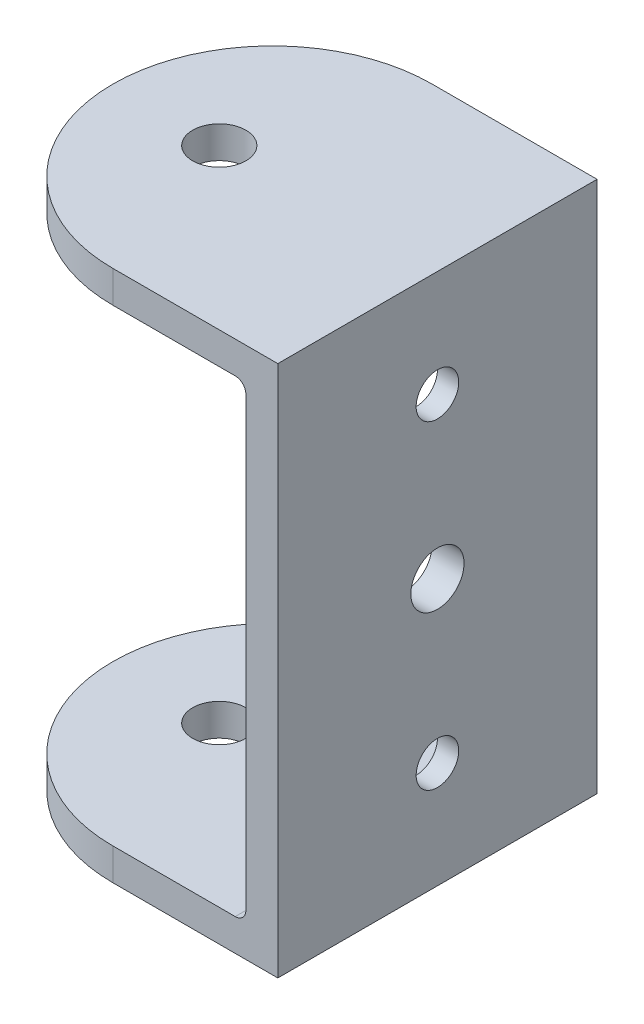
ISO-10303-21;
HEADER;
FILE_DESCRIPTION(('STEP AP214'),'2;1');
FILE_NAME('part.step','',(''),(''),'','','');
FILE_SCHEMA(('AUTOMOTIVE_DESIGN { 1 0 10303 214 1 1 1 1 }'));
ENDSEC;
DATA;
#1=APPLICATION_CONTEXT('core data for automotive mechanical design processes');
#2=APPLICATION_PROTOCOL_DEFINITION('international standard','automotive_design',2000,#1);
#3=PRODUCT_CONTEXT('',#1,'mechanical');
#4=PRODUCT('Part','Part','',(#3));
#5=PRODUCT_RELATED_PRODUCT_CATEGORY('part','',(#4));
#6=PRODUCT_DEFINITION_FORMATION('','',#4);
#7=PRODUCT_DEFINITION_CONTEXT('part definition',#1,'design');
#8=PRODUCT_DEFINITION('design','',#6,#7);
#9=PRODUCT_DEFINITION_SHAPE('','',#8);
#10=(LENGTH_UNIT() NAMED_UNIT(*) SI_UNIT(.MILLI.,.METRE.));
#11=(NAMED_UNIT(*) PLANE_ANGLE_UNIT() SI_UNIT($,.RADIAN.));
#12=(NAMED_UNIT(*) SI_UNIT($,.STERADIAN.) SOLID_ANGLE_UNIT());
#13=UNCERTAINTY_MEASURE_WITH_UNIT(LENGTH_MEASURE(1.E-05),#10,'distance_accuracy_value','');
#14=(GEOMETRIC_REPRESENTATION_CONTEXT(3) GLOBAL_UNCERTAINTY_ASSIGNED_CONTEXT((#13)) GLOBAL_UNIT_ASSIGNED_CONTEXT((#10,
#11,#12)) REPRESENTATION_CONTEXT('',''));
#15=CARTESIAN_POINT('',(0.,0.,0.));
#16=DIRECTION('',(0.,0.,1.));
#17=DIRECTION('',(1.,0.,0.));
#18=AXIS2_PLACEMENT_3D('',#15,#16,#17);
#19=CARTESIAN_POINT('',(0.,-30.,0.));
#20=DIRECTION('',(-1.,0.,0.));
#21=DIRECTION('',(0.,-1.,0.));
#22=AXIS2_PLACEMENT_3D('',#19,#20,#21);
#23=CYLINDRICAL_SURFACE('',#22,4.);
#24=CARTESIAN_POINT('',(0.,-30.,0.));
#25=DIRECTION('',(-1.,0.,0.));
#26=DIRECTION('',(0.,-1.,0.));
#27=AXIS2_PLACEMENT_3D('',#24,#25,#26);
#28=CIRCLE('',#27,4.);
#29=CARTESIAN_POINT('',(0.,-34.,0.));
#30=VERTEX_POINT('',#29);
#31=EDGE_CURVE('E223',#30,#30,#28,.T.);
#32=ORIENTED_EDGE('',*,*,#31,.F.);
#33=EDGE_LOOP('',(#32));
#34=FACE_BOUND('',#33,.T.);
#35=CARTESIAN_POINT('',(-3.99999999999999,-30.,0.));
#36=DIRECTION('',(-1.,0.,0.));
#37=DIRECTION('',(0.,-1.,0.));
#38=AXIS2_PLACEMENT_3D('',#35,#36,#37);
#39=CIRCLE('',#38,4.);
#40=CARTESIAN_POINT('',(-3.99999999999999,-34.,0.));
#41=VERTEX_POINT('',#40);
#42=EDGE_CURVE('E219',#41,#41,#39,.F.);
#43=ORIENTED_EDGE('',*,*,#42,.F.);
#44=EDGE_LOOP('',(#43));
#45=FACE_BOUND('',#44,.T.);
#46=ADVANCED_FACE('F41',(#34,#45),#23,.F.);
#47=CARTESIAN_POINT('',(0.,30.,0.));
#48=DIRECTION('',(-1.,0.,0.));
#49=DIRECTION('',(0.,-1.,0.));
#50=AXIS2_PLACEMENT_3D('',#47,#48,#49);
#51=CYLINDRICAL_SURFACE('',#50,4.);
#52=CARTESIAN_POINT('',(0.,30.,0.));
#53=DIRECTION('',(-1.,0.,0.));
#54=DIRECTION('',(0.,-1.,0.));
#55=AXIS2_PLACEMENT_3D('',#52,#53,#54);
#56=CIRCLE('',#55,4.);
#57=CARTESIAN_POINT('',(0.,26.,0.));
#58=VERTEX_POINT('',#57);
#59=EDGE_CURVE('E215',#58,#58,#56,.T.);
#60=ORIENTED_EDGE('',*,*,#59,.F.);
#61=EDGE_LOOP('',(#60));
#62=FACE_BOUND('',#61,.T.);
#63=CARTESIAN_POINT('',(-4.,30.,0.));
#64=DIRECTION('',(-1.,0.,0.));
#65=DIRECTION('',(0.,-1.,0.));
#66=AXIS2_PLACEMENT_3D('',#63,#64,#65);
#67=CIRCLE('',#66,4.);
#68=CARTESIAN_POINT('',(-4.,26.,0.));
#69=VERTEX_POINT('',#68);
#70=EDGE_CURVE('E216',#69,#69,#67,.F.);
#71=ORIENTED_EDGE('',*,*,#70,.F.);
#72=EDGE_LOOP('',(#71));
#73=FACE_BOUND('',#72,.T.);
#74=ADVANCED_FACE('F280',(#62,#73),#51,.F.);
#75=CARTESIAN_POINT('',(0.,-44.,-30.));
#76=DIRECTION('',(0.,1.,0.));
#77=DIRECTION('',(0.,0.,1.));
#78=AXIS2_PLACEMENT_3D('',#75,#76,#77);
#79=PLANE('',#78);
#80=CARTESIAN_POINT('',(-41.,-44.,0.));
#81=DIRECTION('',(0.,1.,0.));
#82=DIRECTION('',(0.,0.,1.));
#83=AXIS2_PLACEMENT_3D('',#80,#81,#82);
#84=CIRCLE('',#83,5.);
#85=CARTESIAN_POINT('',(-41.,-44.,5.));
#86=VERTEX_POINT('',#85);
#87=EDGE_CURVE('E169',#86,#86,#84,.T.);
#88=ORIENTED_EDGE('',*,*,#87,.F.);
#89=EDGE_LOOP('',(#88));
#90=FACE_BOUND('',#89,.T.);
#91=DIRECTION('',(-1.,0.,0.));
#92=VECTOR('',#91,1.);
#93=CARTESIAN_POINT('',(0.,-44.,30.));
#94=LINE('',#93,#92);
#95=CARTESIAN_POINT('',(-7.99999999999999,-44.,30.));
#96=VERTEX_POINT('',#95);
#97=CARTESIAN_POINT('',(-31.,-44.,30.));
#98=VERTEX_POINT('',#97);
#99=EDGE_CURVE('E166',#96,#98,#94,.T.);
#100=ORIENTED_EDGE('',*,*,#99,.F.);
#101=DIRECTION('',(0.,0.,1.));
#102=VECTOR('',#101,1.);
#103=CARTESIAN_POINT('',(-7.99999999999999,-44.,-30.));
#104=LINE('',#103,#102);
#105=CARTESIAN_POINT('',(-7.99999999999999,-44.,-30.));
#106=VERTEX_POINT('',#105);
#107=EDGE_CURVE('E228',#96,#106,#104,.F.);
#108=ORIENTED_EDGE('',*,*,#107,.T.);
#109=DIRECTION('',(-1.,0.,0.));
#110=VECTOR('',#109,1.);
#111=CARTESIAN_POINT('',(0.,-44.,-30.));
#112=LINE('',#111,#110);
#113=CARTESIAN_POINT('',(-31.,-44.,-30.));
#114=VERTEX_POINT('',#113);
#115=EDGE_CURVE('E155',#106,#114,#112,.T.);
#116=ORIENTED_EDGE('',*,*,#115,.T.);
#117=CARTESIAN_POINT('',(-31.,-44.,0.));
#118=DIRECTION('',(0.,1.,0.));
#119=DIRECTION('',(0.,0.,1.));
#120=AXIS2_PLACEMENT_3D('',#117,#118,#119);
#121=CIRCLE('',#120,30.);
#122=CARTESIAN_POINT('',(-61.,-44.,0.));
#123=VERTEX_POINT('',#122);
#124=EDGE_CURVE('E189',#114,#123,#121,.T.);
#125=ORIENTED_EDGE('',*,*,#124,.T.);
#126=CARTESIAN_POINT('',(-31.,-44.,0.));
#127=DIRECTION('',(0.,1.,0.));
#128=DIRECTION('',(0.,0.,1.));
#129=AXIS2_PLACEMENT_3D('',#126,#127,#128);
#130=CIRCLE('',#129,30.);
#131=EDGE_CURVE('E191',#123,#98,#130,.T.);
#132=ORIENTED_EDGE('',*,*,#131,.T.);
#133=EDGE_LOOP('',(#100,#108,#116,#125,#132));
#134=FACE_BOUND('',#133,.T.);
#135=ADVANCED_FACE('F262',(#90,#134),#79,.T.);
#136=CARTESIAN_POINT('',(-5.99999999999999,0.,-30.));
#137=DIRECTION('',(-1.,0.,0.));
#138=DIRECTION('',(0.,-1.,0.));
#139=AXIS2_PLACEMENT_3D('',#136,#137,#138);
#140=PLANE('',#139);
#141=CARTESIAN_POINT('',(-6.,30.,0.));
#142=DIRECTION('',(-1.,0.,0.));
#143=DIRECTION('',(0.,-1.,0.));
#144=AXIS2_PLACEMENT_3D('',#141,#142,#143);
#145=CIRCLE('',#144,7.);
#146=CARTESIAN_POINT('',(-6.,23.,0.));
#147=VERTEX_POINT('',#146);
#148=EDGE_CURVE('E519',#147,#147,#145,.T.);
#149=ORIENTED_EDGE('',*,*,#148,.F.);
#150=EDGE_LOOP('',(#149));
#151=FACE_BOUND('',#150,.T.);
#152=CARTESIAN_POINT('',(-5.99999999999999,-30.,0.));
#153=DIRECTION('',(-1.,0.,0.));
#154=DIRECTION('',(0.,-1.,0.));
#155=AXIS2_PLACEMENT_3D('',#152,#153,#154);
#156=CIRCLE('',#155,7.);
#157=CARTESIAN_POINT('',(-5.99999999999999,-37.,0.));
#158=VERTEX_POINT('',#157);
#159=EDGE_CURVE('E516',#158,#158,#156,.T.);
#160=ORIENTED_EDGE('',*,*,#159,.F.);
#161=EDGE_LOOP('',(#160));
#162=FACE_BOUND('',#161,.T.);
#163=CARTESIAN_POINT('',(-5.99999999999999,0.,0.));
#164=DIRECTION('',(-1.,0.,0.));
#165=DIRECTION('',(0.,-1.,0.));
#166=AXIS2_PLACEMENT_3D('',#163,#164,#165);
#167=CIRCLE('',#166,5.);
#168=CARTESIAN_POINT('',(-5.99999999999999,-5.,0.));
#169=VERTEX_POINT('',#168);
#170=EDGE_CURVE('E508',#169,#169,#167,.T.);
#171=ORIENTED_EDGE('',*,*,#170,.F.);
#172=EDGE_LOOP('',(#171));
#173=FACE_BOUND('',#172,.T.);
#174=DIRECTION('',(0.,-1.,0.));
#175=VECTOR('',#174,1.);
#176=CARTESIAN_POINT('',(-5.99999999999999,0.,-30.));
#177=LINE('',#176,#175);
#178=CARTESIAN_POINT('',(-6.,42.,-30.));
#179=VERTEX_POINT('',#178);
#180=CARTESIAN_POINT('',(-5.99999999999999,-42.,-30.));
#181=VERTEX_POINT('',#180);
#182=EDGE_CURVE('E150',#179,#181,#177,.T.);
#183=ORIENTED_EDGE('',*,*,#182,.T.);
#184=DIRECTION('',(0.,0.,1.));
#185=VECTOR('',#184,1.);
#186=CARTESIAN_POINT('',(-5.99999999999999,-42.,30.));
#187=LINE('',#186,#185);
#188=CARTESIAN_POINT('',(-5.99999999999999,-42.,30.));
#189=VERTEX_POINT('',#188);
#190=EDGE_CURVE('E225',#181,#189,#187,.T.);
#191=ORIENTED_EDGE('',*,*,#190,.T.);
#192=DIRECTION('',(0.,-1.,0.));
#193=VECTOR('',#192,1.);
#194=CARTESIAN_POINT('',(-5.99999999999999,0.,30.));
#195=LINE('',#194,#193);
#196=CARTESIAN_POINT('',(-6.,42.,30.));
#197=VERTEX_POINT('',#196);
#198=EDGE_CURVE('E157',#197,#189,#195,.T.);
#199=ORIENTED_EDGE('',*,*,#198,.F.);
#200=DIRECTION('',(0.,0.,1.));
#201=VECTOR('',#200,1.);
#202=CARTESIAN_POINT('',(-6.,42.,-30.));
#203=LINE('',#202,#201);
#204=EDGE_CURVE('E207',#197,#179,#203,.F.);
#205=ORIENTED_EDGE('',*,*,#204,.T.);
#206=EDGE_LOOP('',(#183,#191,#199,#205));
#207=FACE_BOUND('',#206,.T.);
#208=ADVANCED_FACE('F240',(#151,#162,#173,#207),#140,.T.);
#209=CARTESIAN_POINT('',(0.,44.,-30.));
#210=DIRECTION('',(0.,1.,0.));
#211=DIRECTION('',(0.,0.,1.));
#212=AXIS2_PLACEMENT_3D('',#209,#210,#211);
#213=PLANE('',#212);
#214=CARTESIAN_POINT('',(-41.,44.,0.));
#215=DIRECTION('',(0.,1.,0.));
#216=DIRECTION('',(0.,0.,1.));
#217=AXIS2_PLACEMENT_3D('',#214,#215,#216);
#218=CIRCLE('',#217,5.);
#219=CARTESIAN_POINT('',(-41.,44.,5.));
#220=VERTEX_POINT('',#219);
#221=EDGE_CURVE('E495',#220,#220,#218,.T.);
#222=ORIENTED_EDGE('',*,*,#221,.T.);
#223=EDGE_LOOP('',(#222));
#224=FACE_BOUND('',#223,.T.);
#225=DIRECTION('',(-1.,0.,0.));
#226=VECTOR('',#225,1.);
#227=CARTESIAN_POINT('',(0.,44.,-30.));
#228=LINE('',#227,#226);
#229=CARTESIAN_POINT('',(-8.,44.,-30.));
#230=VERTEX_POINT('',#229);
#231=CARTESIAN_POINT('',(-31.,44.,-30.));
#232=VERTEX_POINT('',#231);
#233=EDGE_CURVE('E162',#230,#232,#228,.T.);
#234=ORIENTED_EDGE('',*,*,#233,.F.);
#235=DIRECTION('',(0.,0.,1.));
#236=VECTOR('',#235,1.);
#237=CARTESIAN_POINT('',(-8.,44.,-30.));
#238=LINE('',#237,#236);
#239=CARTESIAN_POINT('',(-8.,44.,30.));
#240=VERTEX_POINT('',#239);
#241=EDGE_CURVE('E230',#230,#240,#238,.T.);
#242=ORIENTED_EDGE('',*,*,#241,.T.);
#243=DIRECTION('',(-1.,0.,0.));
#244=VECTOR('',#243,1.);
#245=CARTESIAN_POINT('',(0.,44.,30.));
#246=LINE('',#245,#244);
#247=CARTESIAN_POINT('',(-31.,44.,30.));
#248=VERTEX_POINT('',#247);
#249=EDGE_CURVE('E175',#240,#248,#246,.T.);
#250=ORIENTED_EDGE('',*,*,#249,.T.);
#251=CARTESIAN_POINT('',(-31.,44.,0.));
#252=DIRECTION('',(0.,1.,0.));
#253=DIRECTION('',(0.,0.,1.));
#254=AXIS2_PLACEMENT_3D('',#251,#252,#253);
#255=CIRCLE('',#254,30.);
#256=CARTESIAN_POINT('',(-61.,44.,0.));
#257=VERTEX_POINT('',#256);
#258=EDGE_CURVE('E198',#248,#257,#255,.F.);
#259=ORIENTED_EDGE('',*,*,#258,.T.);
#260=CARTESIAN_POINT('',(-31.,44.,0.));
#261=DIRECTION('',(0.,1.,0.));
#262=DIRECTION('',(0.,0.,1.));
#263=AXIS2_PLACEMENT_3D('',#260,#261,#262);
#264=CIRCLE('',#263,30.);
#265=EDGE_CURVE('E200',#257,#232,#264,.F.);
#266=ORIENTED_EDGE('',*,*,#265,.T.);
#267=EDGE_LOOP('',(#234,#242,#250,#259,#266));
#268=FACE_BOUND('',#267,.T.);
#269=ADVANCED_FACE('F243',(#224,#268),#213,.F.);
#270=CARTESIAN_POINT('',(0.,50.,-30.));
#271=DIRECTION('',(0.,1.,0.));
#272=DIRECTION('',(-1.,0.,0.));
#273=AXIS2_PLACEMENT_3D('',#270,#271,#272);
#274=PLANE('',#273);
#275=CARTESIAN_POINT('',(-41.,50.,0.));
#276=DIRECTION('',(0.,1.,0.));
#277=DIRECTION('',(0.,0.,1.));
#278=AXIS2_PLACEMENT_3D('',#275,#276,#277);
#279=CIRCLE('',#278,5.);
#280=CARTESIAN_POINT('',(-41.,50.,5.));
#281=VERTEX_POINT('',#280);
#282=EDGE_CURVE('E211',#281,#281,#279,.T.);
#283=ORIENTED_EDGE('',*,*,#282,.F.);
#284=EDGE_LOOP('',(#283));
#285=FACE_BOUND('',#284,.T.);
#286=DIRECTION('',(-1.,0.,0.));
#287=VECTOR('',#286,1.);
#288=CARTESIAN_POINT('',(0.,50.,-30.));
#289=LINE('',#288,#287);
#290=CARTESIAN_POINT('',(0.,50.,-30.));
#291=VERTEX_POINT('',#290);
#292=CARTESIAN_POINT('',(-31.,50.,-30.));
#293=VERTEX_POINT('',#292);
#294=EDGE_CURVE('E138',#291,#293,#289,.T.);
#295=ORIENTED_EDGE('',*,*,#294,.T.);
#296=CARTESIAN_POINT('',(-31.,50.,0.));
#297=DIRECTION('',(0.,1.,0.));
#298=DIRECTION('',(-1.,0.,0.));
#299=AXIS2_PLACEMENT_3D('',#296,#297,#298);
#300=CIRCLE('',#299,30.);
#301=CARTESIAN_POINT('',(-61.,50.,0.));
#302=VERTEX_POINT('',#301);
#303=EDGE_CURVE('E205',#293,#302,#300,.T.);
#304=ORIENTED_EDGE('',*,*,#303,.T.);
#305=CARTESIAN_POINT('',(-31.,50.,0.));
#306=DIRECTION('',(0.,1.,0.));
#307=DIRECTION('',(-1.,0.,0.));
#308=AXIS2_PLACEMENT_3D('',#305,#306,#307);
#309=CIRCLE('',#308,30.);
#310=CARTESIAN_POINT('',(-31.,50.,30.));
#311=VERTEX_POINT('',#310);
#312=EDGE_CURVE('E203',#302,#311,#309,.T.);
#313=ORIENTED_EDGE('',*,*,#312,.T.);
#314=DIRECTION('',(-1.,0.,0.));
#315=VECTOR('',#314,1.);
#316=CARTESIAN_POINT('',(0.,50.,30.));
#317=LINE('',#316,#315);
#318=CARTESIAN_POINT('',(0.,50.,30.));
#319=VERTEX_POINT('',#318);
#320=EDGE_CURVE('E172',#319,#311,#317,.T.);
#321=ORIENTED_EDGE('',*,*,#320,.F.);
#322=DIRECTION('',(0.,0.,1.));
#323=VECTOR('',#322,1.);
#324=CARTESIAN_POINT('',(0.,50.,-30.));
#325=LINE('',#324,#323);
#326=EDGE_CURVE('E149',#291,#319,#325,.T.);
#327=ORIENTED_EDGE('',*,*,#326,.F.);
#328=EDGE_LOOP('',(#295,#304,#313,#321,#327));
#329=FACE_BOUND('',#328,.T.);
#330=ADVANCED_FACE('F248',(#285,#329),#274,.T.);
#331=CARTESIAN_POINT('',(0.,0.,-30.));
#332=DIRECTION('',(-1.,0.,0.));
#333=DIRECTION('',(0.,0.,1.));
#334=AXIS2_PLACEMENT_3D('',#331,#332,#333);
#335=PLANE('',#334);
#336=ORIENTED_EDGE('',*,*,#59,.T.);
#337=EDGE_LOOP('',(#336));
#338=FACE_BOUND('',#337,.T.);
#339=CARTESIAN_POINT('',(0.,0.,0.));
#340=DIRECTION('',(-1.,0.,0.));
#341=DIRECTION('',(0.,-1.,0.));
#342=AXIS2_PLACEMENT_3D('',#339,#340,#341);
#343=CIRCLE('',#342,5.);
#344=CARTESIAN_POINT('',(0.,-5.,0.));
#345=VERTEX_POINT('',#344);
#346=EDGE_CURVE('E505',#345,#345,#343,.T.);
#347=ORIENTED_EDGE('',*,*,#346,.T.);
#348=EDGE_LOOP('',(#347));
#349=FACE_BOUND('',#348,.T.);
#350=ORIENTED_EDGE('',*,*,#31,.T.);
#351=EDGE_LOOP('',(#350));
#352=FACE_BOUND('',#351,.T.);
#353=DIRECTION('',(0.,-1.,0.));
#354=VECTOR('',#353,1.);
#355=CARTESIAN_POINT('',(0.,0.,30.));
#356=LINE('',#355,#354);
#357=CARTESIAN_POINT('',(0.,-50.,30.));
#358=VERTEX_POINT('',#357);
#359=EDGE_CURVE('E145',#319,#358,#356,.T.);
#360=ORIENTED_EDGE('',*,*,#359,.T.);
#361=DIRECTION('',(0.,0.,1.));
#362=VECTOR('',#361,1.);
#363=CARTESIAN_POINT('',(0.,-50.,-30.));
#364=LINE('',#363,#362);
#365=CARTESIAN_POINT('',(0.,-50.,-30.));
#366=VERTEX_POINT('',#365);
#367=EDGE_CURVE('E142',#366,#358,#364,.T.);
#368=ORIENTED_EDGE('',*,*,#367,.F.);
#369=DIRECTION('',(0.,-1.,0.));
#370=VECTOR('',#369,1.);
#371=CARTESIAN_POINT('',(0.,0.,-30.));
#372=LINE('',#371,#370);
#373=EDGE_CURVE('E129',#291,#366,#372,.T.);
#374=ORIENTED_EDGE('',*,*,#373,.F.);
#375=ORIENTED_EDGE('',*,*,#326,.T.);
#376=EDGE_LOOP('',(#360,#368,#374,#375));
#377=FACE_BOUND('',#376,.T.);
#378=ADVANCED_FACE('F143',(#338,#349,#352,#377),#335,.F.);
#379=CARTESIAN_POINT('',(0.,-50.0000000000001,-30.));
#380=DIRECTION('',(0.,1.,0.));
#381=DIRECTION('',(-1.,0.,0.));
#382=AXIS2_PLACEMENT_3D('',#379,#380,#381);
#383=PLANE('',#382);
#384=CARTESIAN_POINT('',(-41.,-50.,0.));
#385=DIRECTION('',(0.,1.,0.));
#386=DIRECTION('',(0.,0.,1.));
#387=AXIS2_PLACEMENT_3D('',#384,#385,#386);
#388=CIRCLE('',#387,5.);
#389=CARTESIAN_POINT('',(-41.,-50.,5.));
#390=VERTEX_POINT('',#389);
#391=EDGE_CURVE('E496',#390,#390,#388,.T.);
#392=ORIENTED_EDGE('',*,*,#391,.T.);
#393=EDGE_LOOP('',(#392));
#394=FACE_BOUND('',#393,.T.);
#395=DIRECTION('',(-1.,0.,0.));
#396=VECTOR('',#395,1.);
#397=CARTESIAN_POINT('',(0.,-50.0000000000001,30.));
#398=LINE('',#397,#396);
#399=CARTESIAN_POINT('',(-31.,-50.,30.));
#400=VERTEX_POINT('',#399);
#401=EDGE_CURVE('E168',#358,#400,#398,.T.);
#402=ORIENTED_EDGE('',*,*,#401,.T.);
#403=CARTESIAN_POINT('',(-31.,-50.,0.));
#404=DIRECTION('',(0.,1.,0.));
#405=DIRECTION('',(-1.,0.,0.));
#406=AXIS2_PLACEMENT_3D('',#403,#404,#405);
#407=CIRCLE('',#406,30.);
#408=CARTESIAN_POINT('',(-61.,-50.,0.));
#409=VERTEX_POINT('',#408);
#410=EDGE_CURVE('E187',#400,#409,#407,.F.);
#411=ORIENTED_EDGE('',*,*,#410,.T.);
#412=CARTESIAN_POINT('',(-31.,-50.,0.));
#413=DIRECTION('',(0.,1.,0.));
#414=DIRECTION('',(-1.,0.,0.));
#415=AXIS2_PLACEMENT_3D('',#412,#413,#414);
#416=CIRCLE('',#415,30.);
#417=CARTESIAN_POINT('',(-31.,-50.,-30.));
#418=VERTEX_POINT('',#417);
#419=EDGE_CURVE('E154',#409,#418,#416,.F.);
#420=ORIENTED_EDGE('',*,*,#419,.T.);
#421=DIRECTION('',(-1.,0.,0.));
#422=VECTOR('',#421,1.);
#423=CARTESIAN_POINT('',(0.,-50.0000000000001,-30.));
#424=LINE('',#423,#422);
#425=EDGE_CURVE('E134',#366,#418,#424,.T.);
#426=ORIENTED_EDGE('',*,*,#425,.F.);
#427=ORIENTED_EDGE('',*,*,#367,.T.);
#428=EDGE_LOOP('',(#402,#411,#420,#426,#427));
#429=FACE_BOUND('',#428,.T.);
#430=ADVANCED_FACE('F152',(#394,#429),#383,.F.);
#431=CARTESIAN_POINT('',(0.,0.,-30.));
#432=DIRECTION('',(0.,0.,1.));
#433=DIRECTION('',(1.,0.,0.));
#434=AXIS2_PLACEMENT_3D('',#431,#432,#433);
#435=PLANE('',#434);
#436=ORIENTED_EDGE('',*,*,#425,.T.);
#437=DIRECTION('',(0.,-1.,0.));
#438=VECTOR('',#437,1.);
#439=CARTESIAN_POINT('',(-31.,-44.,-30.));
#440=LINE('',#439,#438);
#441=EDGE_CURVE('E196',#418,#114,#440,.F.);
#442=ORIENTED_EDGE('',*,*,#441,.T.);
#443=ORIENTED_EDGE('',*,*,#115,.F.);
#444=CARTESIAN_POINT('',(-7.99999999999999,-42.,-30.));
#445=DIRECTION('',(0.,0.,1.));
#446=DIRECTION('',(1.,0.,0.));
#447=AXIS2_PLACEMENT_3D('',#444,#445,#446);
#448=CIRCLE('',#447,2.);
#449=EDGE_CURVE('E234',#106,#181,#448,.T.);
#450=ORIENTED_EDGE('',*,*,#449,.T.);
#451=ORIENTED_EDGE('',*,*,#182,.F.);
#452=CARTESIAN_POINT('',(-8.,42.,-30.));
#453=DIRECTION('',(0.,0.,1.));
#454=DIRECTION('',(1.,0.,0.));
#455=AXIS2_PLACEMENT_3D('',#452,#453,#454);
#456=CIRCLE('',#455,2.);
#457=EDGE_CURVE('E11',#179,#230,#456,.T.);
#458=ORIENTED_EDGE('',*,*,#457,.T.);
#459=ORIENTED_EDGE('',*,*,#233,.T.);
#460=DIRECTION('',(0.,-1.,0.));
#461=VECTOR('',#460,1.);
#462=CARTESIAN_POINT('',(-31.,50.,-30.));
#463=LINE('',#462,#461);
#464=EDGE_CURVE('E194',#232,#293,#463,.F.);
#465=ORIENTED_EDGE('',*,*,#464,.T.);
#466=ORIENTED_EDGE('',*,*,#294,.F.);
#467=ORIENTED_EDGE('',*,*,#373,.T.);
#468=EDGE_LOOP('',(#436,#442,#443,#450,#451,#458,#459,#465,#466,#467));
#469=FACE_BOUND('',#468,.T.);
#470=ADVANCED_FACE('F131',(#469),#435,.F.);
#471=CARTESIAN_POINT('',(0.,0.,30.));
#472=DIRECTION('',(0.,0.,1.));
#473=DIRECTION('',(1.,0.,0.));
#474=AXIS2_PLACEMENT_3D('',#471,#472,#473);
#475=PLANE('',#474);
#476=ORIENTED_EDGE('',*,*,#198,.T.);
#477=CARTESIAN_POINT('',(-7.99999999999999,-42.,30.));
#478=DIRECTION('',(0.,0.,1.));
#479=DIRECTION('',(1.,0.,0.));
#480=AXIS2_PLACEMENT_3D('',#477,#478,#479);
#481=CIRCLE('',#480,2.);
#482=EDGE_CURVE('E232',#189,#96,#481,.F.);
#483=ORIENTED_EDGE('',*,*,#482,.T.);
#484=ORIENTED_EDGE('',*,*,#99,.T.);
#485=DIRECTION('',(0.,-1.,0.));
#486=VECTOR('',#485,1.);
#487=CARTESIAN_POINT('',(-31.,0.,30.));
#488=LINE('',#487,#486);
#489=EDGE_CURVE('E183',#98,#400,#488,.T.);
#490=ORIENTED_EDGE('',*,*,#489,.T.);
#491=ORIENTED_EDGE('',*,*,#401,.F.);
#492=ORIENTED_EDGE('',*,*,#359,.F.);
#493=ORIENTED_EDGE('',*,*,#320,.T.);
#494=DIRECTION('',(0.,-1.,0.));
#495=VECTOR('',#494,1.);
#496=CARTESIAN_POINT('',(-31.,0.,30.));
#497=LINE('',#496,#495);
#498=EDGE_CURVE('E179',#311,#248,#497,.T.);
#499=ORIENTED_EDGE('',*,*,#498,.T.);
#500=ORIENTED_EDGE('',*,*,#249,.F.);
#501=CARTESIAN_POINT('',(-8.,42.,30.));
#502=DIRECTION('',(0.,0.,1.));
#503=DIRECTION('',(1.,0.,0.));
#504=AXIS2_PLACEMENT_3D('',#501,#502,#503);
#505=CIRCLE('',#504,2.);
#506=EDGE_CURVE('E49',#240,#197,#505,.F.);
#507=ORIENTED_EDGE('',*,*,#506,.T.);
#508=EDGE_LOOP('',(#476,#483,#484,#490,#491,#492,#493,#499,#500,#507));
#509=FACE_BOUND('',#508,.T.);
#510=ADVANCED_FACE('F238',(#509),#475,.T.);
#511=CARTESIAN_POINT('',(-41.,-50.,0.));
#512=DIRECTION('',(0.,1.,0.));
#513=DIRECTION('',(0.,0.,1.));
#514=AXIS2_PLACEMENT_3D('',#511,#512,#513);
#515=CYLINDRICAL_SURFACE('',#514,5.);
#516=ORIENTED_EDGE('',*,*,#87,.T.);
#517=EDGE_LOOP('',(#516));
#518=FACE_BOUND('',#517,.T.);
#519=ORIENTED_EDGE('',*,*,#391,.F.);
#520=EDGE_LOOP('',(#519));
#521=FACE_BOUND('',#520,.T.);
#522=ADVANCED_FACE('F294',(#518,#521),#515,.F.);
#523=ORIENTED_EDGE('',*,*,#282,.T.);
#524=EDGE_LOOP('',(#523));
#525=FACE_BOUND('',#524,.T.);
#526=ORIENTED_EDGE('',*,*,#221,.F.);
#527=EDGE_LOOP('',(#526));
#528=FACE_BOUND('',#527,.T.);
#529=ADVANCED_FACE('F297',(#525,#528),#515,.F.);
#530=CARTESIAN_POINT('',(-31.,0.,0.));
#531=DIRECTION('',(0.,1.,0.));
#532=DIRECTION('',(0.,0.,1.));
#533=AXIS2_PLACEMENT_3D('',#530,#531,#532);
#534=CYLINDRICAL_SURFACE('',#533,30.);
#535=DIRECTION('',(0.,-1.,0.));
#536=VECTOR('',#535,1.);
#537=CARTESIAN_POINT('',(-61.,-50.,0.));
#538=LINE('',#537,#536);
#539=EDGE_CURVE('E208',#123,#409,#538,.T.);
#540=ORIENTED_EDGE('',*,*,#539,.F.);
#541=ORIENTED_EDGE('',*,*,#124,.F.);
#542=ORIENTED_EDGE('',*,*,#441,.F.);
#543=ORIENTED_EDGE('',*,*,#419,.F.);
#544=EDGE_LOOP('',(#540,#541,#542,#543));
#545=FACE_BOUND('',#544,.T.);
#546=ADVANCED_FACE('F256',(#545),#534,.T.);
#547=CARTESIAN_POINT('',(-31.,0.,0.));
#548=DIRECTION('',(0.,-1.,0.));
#549=DIRECTION('',(0.,0.,-1.));
#550=AXIS2_PLACEMENT_3D('',#547,#548,#549);
#551=CYLINDRICAL_SURFACE('',#550,30.);
#552=ORIENTED_EDGE('',*,*,#131,.F.);
#553=ORIENTED_EDGE('',*,*,#539,.T.);
#554=ORIENTED_EDGE('',*,*,#410,.F.);
#555=ORIENTED_EDGE('',*,*,#489,.F.);
#556=EDGE_LOOP('',(#552,#553,#554,#555));
#557=FACE_BOUND('',#556,.T.);
#558=ADVANCED_FACE('F259',(#557),#551,.T.);
#559=CARTESIAN_POINT('',(-31.,0.,0.));
#560=DIRECTION('',(0.,-1.,0.));
#561=DIRECTION('',(0.,0.,-1.));
#562=AXIS2_PLACEMENT_3D('',#559,#560,#561);
#563=CYLINDRICAL_SURFACE('',#562,30.);
#564=ORIENTED_EDGE('',*,*,#498,.F.);
#565=ORIENTED_EDGE('',*,*,#312,.F.);
#566=DIRECTION('',(0.,-1.,0.));
#567=VECTOR('',#566,1.);
#568=CARTESIAN_POINT('',(-61.,0.,0.));
#569=LINE('',#568,#567);
#570=EDGE_CURVE('E212',#257,#302,#569,.F.);
#571=ORIENTED_EDGE('',*,*,#570,.F.);
#572=ORIENTED_EDGE('',*,*,#258,.F.);
#573=EDGE_LOOP('',(#564,#565,#571,#572));
#574=FACE_BOUND('',#573,.T.);
#575=ADVANCED_FACE('F322',(#574),#563,.T.);
#576=CARTESIAN_POINT('',(-31.,0.,0.));
#577=DIRECTION('',(0.,1.,0.));
#578=DIRECTION('',(0.,0.,1.));
#579=AXIS2_PLACEMENT_3D('',#576,#577,#578);
#580=CYLINDRICAL_SURFACE('',#579,30.);
#581=ORIENTED_EDGE('',*,*,#303,.F.);
#582=ORIENTED_EDGE('',*,*,#464,.F.);
#583=ORIENTED_EDGE('',*,*,#265,.F.);
#584=ORIENTED_EDGE('',*,*,#570,.T.);
#585=EDGE_LOOP('',(#581,#582,#583,#584));
#586=FACE_BOUND('',#585,.T.);
#587=ADVANCED_FACE('F325',(#586),#580,.T.);
#588=CARTESIAN_POINT('',(0.,0.,0.));
#589=DIRECTION('',(-1.,0.,0.));
#590=DIRECTION('',(0.,-1.,0.));
#591=AXIS2_PLACEMENT_3D('',#588,#589,#590);
#592=CYLINDRICAL_SURFACE('',#591,5.);
#593=ORIENTED_EDGE('',*,*,#346,.F.);
#594=EDGE_LOOP('',(#593));
#595=FACE_BOUND('',#594,.T.);
#596=ORIENTED_EDGE('',*,*,#170,.T.);
#597=EDGE_LOOP('',(#596));
#598=FACE_BOUND('',#597,.T.);
#599=ADVANCED_FACE('F293',(#595,#598),#592,.F.);
#600=CARTESIAN_POINT('',(-4.,30.,0.));
#601=DIRECTION('',(-1.,0.,0.));
#602=DIRECTION('',(0.,-1.,0.));
#603=AXIS2_PLACEMENT_3D('',#600,#601,#602);
#604=PLANE('',#603);
#605=CARTESIAN_POINT('',(-4.,30.,0.));
#606=DIRECTION('',(-1.,0.,0.));
#607=DIRECTION('',(0.,-1.,0.));
#608=AXIS2_PLACEMENT_3D('',#605,#606,#607);
#609=CIRCLE('',#608,7.);
#610=CARTESIAN_POINT('',(-4.,23.,0.));
#611=VERTEX_POINT('',#610);
#612=EDGE_CURVE('E220',#611,#611,#609,.T.);
#613=ORIENTED_EDGE('',*,*,#612,.T.);
#614=EDGE_LOOP('',(#613));
#615=FACE_BOUND('',#614,.T.);
#616=ORIENTED_EDGE('',*,*,#70,.T.);
#617=EDGE_LOOP('',(#616));
#618=FACE_BOUND('',#617,.T.);
#619=ADVANCED_FACE('F352',(#615,#618),#604,.T.);
#620=CARTESIAN_POINT('',(-4.,30.,0.));
#621=DIRECTION('',(-1.,0.,0.));
#622=DIRECTION('',(0.,-1.,0.));
#623=AXIS2_PLACEMENT_3D('',#620,#621,#622);
#624=CYLINDRICAL_SURFACE('',#623,7.);
#625=ORIENTED_EDGE('',*,*,#612,.F.);
#626=EDGE_LOOP('',(#625));
#627=FACE_BOUND('',#626,.T.);
#628=ORIENTED_EDGE('',*,*,#148,.T.);
#629=EDGE_LOOP('',(#628));
#630=FACE_BOUND('',#629,.T.);
#631=ADVANCED_FACE('F373',(#627,#630),#624,.F.);
#632=CARTESIAN_POINT('',(-3.99999999999999,-30.,0.));
#633=DIRECTION('',(-1.,0.,0.));
#634=DIRECTION('',(0.,-1.,0.));
#635=AXIS2_PLACEMENT_3D('',#632,#633,#634);
#636=PLANE('',#635);
#637=CARTESIAN_POINT('',(-3.99999999999999,-30.,0.));
#638=DIRECTION('',(-1.,0.,0.));
#639=DIRECTION('',(0.,-1.,0.));
#640=AXIS2_PLACEMENT_3D('',#637,#638,#639);
#641=CIRCLE('',#640,7.);
#642=CARTESIAN_POINT('',(-3.99999999999999,-37.,0.));
#643=VERTEX_POINT('',#642);
#644=EDGE_CURVE('E513',#643,#643,#641,.T.);
#645=ORIENTED_EDGE('',*,*,#644,.T.);
#646=EDGE_LOOP('',(#645));
#647=FACE_BOUND('',#646,.T.);
#648=ORIENTED_EDGE('',*,*,#42,.T.);
#649=EDGE_LOOP('',(#648));
#650=FACE_BOUND('',#649,.T.);
#651=ADVANCED_FACE('F275',(#647,#650),#636,.T.);
#652=CARTESIAN_POINT('',(-3.99999999999999,-30.,0.));
#653=DIRECTION('',(-1.,0.,0.));
#654=DIRECTION('',(0.,-1.,0.));
#655=AXIS2_PLACEMENT_3D('',#652,#653,#654);
#656=CYLINDRICAL_SURFACE('',#655,7.);
#657=ORIENTED_EDGE('',*,*,#644,.F.);
#658=EDGE_LOOP('',(#657));
#659=FACE_BOUND('',#658,.T.);
#660=ORIENTED_EDGE('',*,*,#159,.T.);
#661=EDGE_LOOP('',(#660));
#662=FACE_BOUND('',#661,.T.);
#663=ADVANCED_FACE('F269',(#659,#662),#656,.F.);
#664=CARTESIAN_POINT('',(-7.99999999999999,-42.,-30.));
#665=DIRECTION('',(0.,0.,-1.));
#666=DIRECTION('',(-1.,0.,0.));
#667=AXIS2_PLACEMENT_3D('',#664,#665,#666);
#668=CYLINDRICAL_SURFACE('',#667,2.);
#669=ORIENTED_EDGE('',*,*,#449,.F.);
#670=ORIENTED_EDGE('',*,*,#107,.F.);
#671=ORIENTED_EDGE('',*,*,#482,.F.);
#672=ORIENTED_EDGE('',*,*,#190,.F.);
#673=EDGE_LOOP('',(#669,#670,#671,#672));
#674=FACE_BOUND('',#673,.T.);
#675=ADVANCED_FACE('F267',(#674),#668,.F.);
#676=CARTESIAN_POINT('',(-8.,42.,-30.));
#677=DIRECTION('',(0.,0.,1.));
#678=DIRECTION('',(1.,0.,0.));
#679=AXIS2_PLACEMENT_3D('',#676,#677,#678);
#680=CYLINDRICAL_SURFACE('',#679,2.);
#681=ORIENTED_EDGE('',*,*,#457,.F.);
#682=ORIENTED_EDGE('',*,*,#204,.F.);
#683=ORIENTED_EDGE('',*,*,#506,.F.);
#684=ORIENTED_EDGE('',*,*,#241,.F.);
#685=EDGE_LOOP('',(#681,#682,#683,#684));
#686=FACE_BOUND('',#685,.T.);
#687=ADVANCED_FACE('F43',(#686),#680,.F.);
#688=CLOSED_SHELL('',(#46,#74,#135,#208,#269,#330,#378,#430,#470,#510,#522,#529,#546,#558,#575,
#587,#599,#619,#631,#651,#663,#675,#687));
#689=MANIFOLD_SOLID_BREP('B2',#688);
#690=ADVANCED_BREP_SHAPE_REPRESENTATION('',(#18,#689),#14);
#691=SHAPE_DEFINITION_REPRESENTATION(#9,#690);
ENDSEC;
END-ISO-10303-21;
